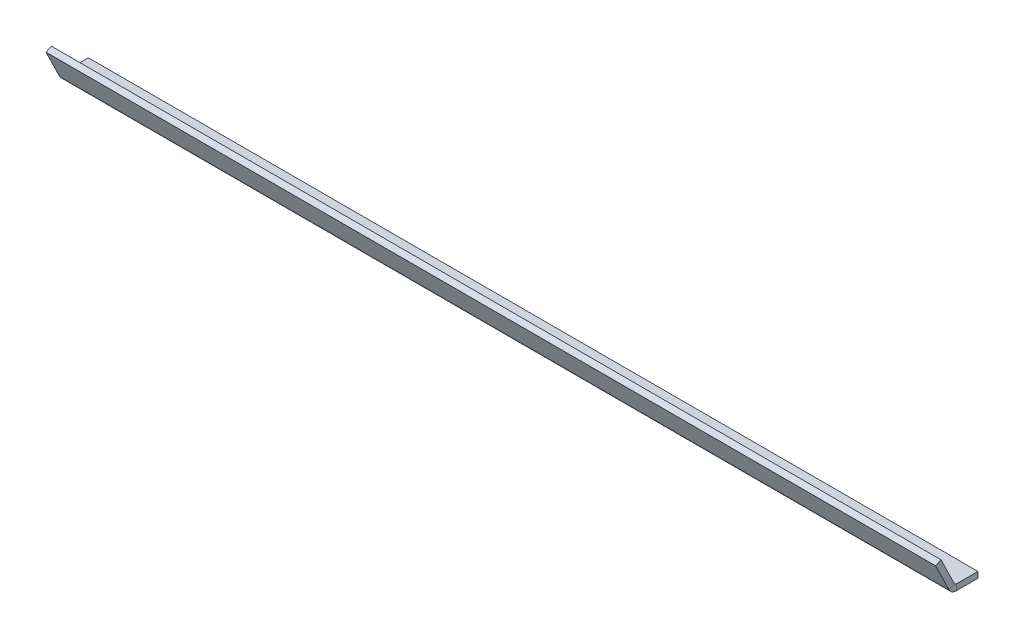
ISO-10303-21;
HEADER;
FILE_DESCRIPTION(('STEP AP214'),'2;1');
FILE_NAME('part.step','',(''),(''),'','','');
FILE_SCHEMA(('AUTOMOTIVE_DESIGN { 1 0 10303 214 1 1 1 1 }'));
ENDSEC;
DATA;
#1=APPLICATION_CONTEXT('core data for automotive mechanical design processes');
#2=APPLICATION_PROTOCOL_DEFINITION('international standard','automotive_design',2000,#1);
#3=PRODUCT_CONTEXT('',#1,'mechanical');
#4=PRODUCT('Part','Part','',(#3));
#5=PRODUCT_RELATED_PRODUCT_CATEGORY('part','',(#4));
#6=PRODUCT_DEFINITION_FORMATION('','',#4);
#7=PRODUCT_DEFINITION_CONTEXT('part definition',#1,'design');
#8=PRODUCT_DEFINITION('design','',#6,#7);
#9=PRODUCT_DEFINITION_SHAPE('','',#8);
#10=(LENGTH_UNIT() NAMED_UNIT(*) SI_UNIT(.MILLI.,.METRE.));
#11=(NAMED_UNIT(*) PLANE_ANGLE_UNIT() SI_UNIT($,.RADIAN.));
#12=(NAMED_UNIT(*) SI_UNIT($,.STERADIAN.) SOLID_ANGLE_UNIT());
#13=UNCERTAINTY_MEASURE_WITH_UNIT(LENGTH_MEASURE(1.E-05),#10,'distance_accuracy_value','');
#14=(GEOMETRIC_REPRESENTATION_CONTEXT(3) GLOBAL_UNCERTAINTY_ASSIGNED_CONTEXT((#13)) GLOBAL_UNIT_ASSIGNED_CONTEXT((#10,
#11,#12)) REPRESENTATION_CONTEXT('',''));
#15=CARTESIAN_POINT('',(0.,0.,0.));
#16=DIRECTION('',(0.,0.,1.));
#17=DIRECTION('',(1.,0.,0.));
#18=AXIS2_PLACEMENT_3D('',#15,#16,#17);
#19=CARTESIAN_POINT('',(600.,-8.,-1.14215139778495E-13));
#20=DIRECTION('',(1.,0.,0.));
#21=DIRECTION('',(0.,0.,-1.));
#22=AXIS2_PLACEMENT_3D('',#19,#20,#21);
#23=PLANE('',#22);
#24=DIRECTION('',(0.,0.,-1.));
#25=VECTOR('',#24,1.);
#26=CARTESIAN_POINT('',(600.,0.,-1.14215139778495E-13));
#27=LINE('',#26,#25);
#28=CARTESIAN_POINT('',(600.,0.,-10.7754235795295));
#29=VERTEX_POINT('',#28);
#30=CARTESIAN_POINT('',(600.,0.,-40.0000000000001));
#31=VERTEX_POINT('',#30);
#32=EDGE_CURVE('E104',#29,#31,#27,.T.);
#33=ORIENTED_EDGE('',*,*,#32,.F.);
#34=DIRECTION('',(0.,-1.,0.));
#35=VECTOR('',#34,1.);
#36=CARTESIAN_POINT('',(600.,1.55257751099924E-13,-10.7754235795295));
#37=LINE('',#36,#35);
#38=CARTESIAN_POINT('',(600.,-7.99999999999984,-10.7754235795297));
#39=VERTEX_POINT('',#38);
#40=EDGE_CURVE('E113',#29,#39,#37,.T.);
#41=ORIENTED_EDGE('',*,*,#40,.T.);
#42=DIRECTION('',(0.,0.,-1.));
#43=VECTOR('',#42,1.);
#44=CARTESIAN_POINT('',(600.,-8.,-1.14215139778495E-13));
#45=LINE('',#44,#43);
#46=CARTESIAN_POINT('',(600.,-8.,-40.0000000000001));
#47=VERTEX_POINT('',#46);
#48=EDGE_CURVE('E101',#39,#47,#45,.T.);
#49=ORIENTED_EDGE('',*,*,#48,.T.);
#50=DIRECTION('',(0.,1.,0.));
#51=VECTOR('',#50,1.);
#52=CARTESIAN_POINT('',(600.,-8.,-40.0000000000001));
#53=LINE('',#52,#51);
#54=EDGE_CURVE('E59',#47,#31,#53,.T.);
#55=ORIENTED_EDGE('',*,*,#54,.T.);
#56=EDGE_LOOP('',(#33,#41,#49,#55));
#57=FACE_BOUND('',#56,.T.);
#58=ADVANCED_FACE('F56',(#57),#23,.T.);
#59=CARTESIAN_POINT('',(0.,-8.,0.));
#60=DIRECTION('',(0.,1.,0.));
#61=DIRECTION('',(0.,0.,1.));
#62=AXIS2_PLACEMENT_3D('',#59,#60,#61);
#63=PLANE('',#62);
#64=DIRECTION('',(1.,0.,0.));
#65=VECTOR('',#64,1.);
#66=CARTESIAN_POINT('',(600.,-7.99999999999984,-10.7754235795297));
#67=LINE('',#66,#65);
#68=CARTESIAN_POINT('',(-600.,-8.,-10.7754235795295));
#69=VERTEX_POINT('',#68);
#70=EDGE_CURVE('E129',#39,#69,#67,.F.);
#71=ORIENTED_EDGE('',*,*,#70,.T.);
#72=DIRECTION('',(0.,0.,1.));
#73=VECTOR('',#72,1.);
#74=CARTESIAN_POINT('',(-600.,-8.,0.));
#75=LINE('',#74,#73);
#76=CARTESIAN_POINT('',(-600.,-8.,-40.));
#77=VERTEX_POINT('',#76);
#78=EDGE_CURVE('E109',#77,#69,#75,.T.);
#79=ORIENTED_EDGE('',*,*,#78,.F.);
#80=DIRECTION('',(-1.,0.,0.));
#81=VECTOR('',#80,1.);
#82=CARTESIAN_POINT('',(600.,-8.,-40.0000000000001));
#83=LINE('',#82,#81);
#84=EDGE_CURVE('E94',#47,#77,#83,.T.);
#85=ORIENTED_EDGE('',*,*,#84,.F.);
#86=ORIENTED_EDGE('',*,*,#48,.F.);
#87=EDGE_LOOP('',(#71,#79,#85,#86));
#88=FACE_BOUND('',#87,.T.);
#89=ADVANCED_FACE('F207',(#88),#63,.F.);
#90=CARTESIAN_POINT('',(0.,0.,0.));
#91=DIRECTION('',(0.,1.,0.));
#92=DIRECTION('',(0.,0.,1.));
#93=AXIS2_PLACEMENT_3D('',#90,#91,#92);
#94=PLANE('',#93);
#95=DIRECTION('',(0.,0.,1.));
#96=VECTOR('',#95,1.);
#97=CARTESIAN_POINT('',(-600.,0.,0.));
#98=LINE('',#97,#96);
#99=CARTESIAN_POINT('',(-600.,0.,-40.));
#100=VERTEX_POINT('',#99);
#101=CARTESIAN_POINT('',(-600.,0.,-10.7754235795295));
#102=VERTEX_POINT('',#101);
#103=EDGE_CURVE('E96',#100,#102,#98,.T.);
#104=ORIENTED_EDGE('',*,*,#103,.T.);
#105=DIRECTION('',(1.,0.,0.));
#106=VECTOR('',#105,1.);
#107=CARTESIAN_POINT('',(600.,1.55257751099924E-13,-10.7754235795295));
#108=LINE('',#107,#106);
#109=EDGE_CURVE('E70',#29,#102,#108,.F.);
#110=ORIENTED_EDGE('',*,*,#109,.F.);
#111=ORIENTED_EDGE('',*,*,#32,.T.);
#112=DIRECTION('',(-1.,0.,0.));
#113=VECTOR('',#112,1.);
#114=CARTESIAN_POINT('',(600.,0.,-40.0000000000001));
#115=LINE('',#114,#113);
#116=EDGE_CURVE('E92',#31,#100,#115,.T.);
#117=ORIENTED_EDGE('',*,*,#116,.T.);
#118=EDGE_LOOP('',(#104,#110,#111,#117));
#119=FACE_BOUND('',#118,.T.);
#120=ADVANCED_FACE('F103',(#119),#94,.T.);
#121=CARTESIAN_POINT('',(-600.,-8.,0.));
#122=DIRECTION('',(-1.,0.,0.));
#123=DIRECTION('',(0.,0.,1.));
#124=AXIS2_PLACEMENT_3D('',#121,#122,#123);
#125=PLANE('',#124);
#126=DIRECTION('',(0.,-1.,0.));
#127=VECTOR('',#126,1.);
#128=CARTESIAN_POINT('',(-600.,0.,-10.7754235795295));
#129=LINE('',#128,#127);
#130=EDGE_CURVE('E100',#102,#69,#129,.T.);
#131=ORIENTED_EDGE('',*,*,#130,.F.);
#132=ORIENTED_EDGE('',*,*,#103,.F.);
#133=DIRECTION('',(0.,1.,0.));
#134=VECTOR('',#133,1.);
#135=CARTESIAN_POINT('',(-600.,-8.,-40.));
#136=LINE('',#135,#134);
#137=EDGE_CURVE('E13',#77,#100,#136,.T.);
#138=ORIENTED_EDGE('',*,*,#137,.F.);
#139=ORIENTED_EDGE('',*,*,#78,.T.);
#140=EDGE_LOOP('',(#131,#132,#138,#139));
#141=FACE_BOUND('',#140,.T.);
#142=ADVANCED_FACE('F97',(#141),#125,.T.);
#143=CARTESIAN_POINT('',(600.,-8.,-40.0000000000001));
#144=DIRECTION('',(0.,0.,-1.));
#145=DIRECTION('',(-1.,0.,0.));
#146=AXIS2_PLACEMENT_3D('',#143,#144,#145);
#147=PLANE('',#146);
#148=ORIENTED_EDGE('',*,*,#116,.F.);
#149=ORIENTED_EDGE('',*,*,#54,.F.);
#150=ORIENTED_EDGE('',*,*,#84,.T.);
#151=ORIENTED_EDGE('',*,*,#137,.T.);
#152=EDGE_LOOP('',(#148,#149,#150,#151));
#153=FACE_BOUND('',#152,.T.);
#154=ADVANCED_FACE('F89',(#153),#147,.T.);
#155=CARTESIAN_POINT('',(-600.,3.00000000000001,-10.7754235795295));
#156=DIRECTION('',(-1.,0.,0.));
#157=DIRECTION('',(0.,-1.,0.));
#158=AXIS2_PLACEMENT_3D('',#155,#156,#157);
#159=PLANE('',#158);
#160=DIRECTION('',(0.,0.438371146789081,-0.898794046299165));
#161=VECTOR('',#160,1.);
#162=CARTESIAN_POINT('',(-600.,-1.82208261467989,-0.888689070238611));
#163=LINE('',#162,#161);
#164=CARTESIAN_POINT('',(-600.,1.68488655963275,-8.07904144063195));
#165=VERTEX_POINT('',#164);
#166=CARTESIAN_POINT('',(-600.,-1.8220826146799,-0.888689070238625));
#167=VERTEX_POINT('',#166);
#168=EDGE_CURVE('E134',#165,#167,#163,.F.);
#169=ORIENTED_EDGE('',*,*,#168,.F.);
#170=CARTESIAN_POINT('',(-600.,3.00000000000001,-10.7754235795295));
#171=DIRECTION('',(1.,0.,0.));
#172=DIRECTION('',(0.,1.,0.));
#173=AXIS2_PLACEMENT_3D('',#170,#171,#172);
#174=CIRCLE('',#173,3.00000000000003);
#175=EDGE_CURVE('E123',#102,#165,#174,.F.);
#176=ORIENTED_EDGE('',*,*,#175,.F.);
#177=ORIENTED_EDGE('',*,*,#130,.T.);
#178=CARTESIAN_POINT('',(-600.,3.00000000000001,-10.7754235795295));
#179=DIRECTION('',(1.,0.,0.));
#180=DIRECTION('',(0.,1.,0.));
#181=AXIS2_PLACEMENT_3D('',#178,#179,#180);
#182=CIRCLE('',#181,11.);
#183=EDGE_CURVE('E116',#69,#167,#182,.F.);
#184=ORIENTED_EDGE('',*,*,#183,.T.);
#185=EDGE_LOOP('',(#169,#176,#177,#184));
#186=FACE_BOUND('',#185,.T.);
#187=ADVANCED_FACE('F211',(#186),#159,.T.);
#188=CARTESIAN_POINT('',(600.,3.00000000000018,-10.7754235795295));
#189=DIRECTION('',(-1.,0.,0.));
#190=DIRECTION('',(0.,-1.,0.));
#191=AXIS2_PLACEMENT_3D('',#188,#189,#190);
#192=PLANE('',#191);
#193=CARTESIAN_POINT('',(600.,3.00000000000018,-10.7754235795295));
#194=DIRECTION('',(1.,0.,0.));
#195=DIRECTION('',(0.,1.,0.));
#196=AXIS2_PLACEMENT_3D('',#193,#194,#195);
#197=CIRCLE('',#196,3.00000000000003);
#198=CARTESIAN_POINT('',(600.,1.68488655963293,-8.07904144063195));
#199=VERTEX_POINT('',#198);
#200=EDGE_CURVE('E118',#199,#29,#197,.T.);
#201=ORIENTED_EDGE('',*,*,#200,.F.);
#202=DIRECTION('',(0.,0.438371146789081,-0.898794046299165));
#203=VECTOR('',#202,1.);
#204=CARTESIAN_POINT('',(600.,1.68488655963294,-8.07904144063201));
#205=LINE('',#204,#203);
#206=CARTESIAN_POINT('',(600.,-1.82208261467972,-0.888689070238673));
#207=VERTEX_POINT('',#206);
#208=EDGE_CURVE('E140',#199,#207,#205,.F.);
#209=ORIENTED_EDGE('',*,*,#208,.T.);
#210=CARTESIAN_POINT('',(600.,3.00000000000018,-10.7754235795295));
#211=DIRECTION('',(1.,0.,0.));
#212=DIRECTION('',(0.,1.,0.));
#213=AXIS2_PLACEMENT_3D('',#210,#211,#212);
#214=CIRCLE('',#213,11.);
#215=EDGE_CURVE('E126',#207,#39,#214,.T.);
#216=ORIENTED_EDGE('',*,*,#215,.T.);
#217=ORIENTED_EDGE('',*,*,#40,.F.);
#218=EDGE_LOOP('',(#201,#209,#216,#217));
#219=FACE_BOUND('',#218,.T.);
#220=ADVANCED_FACE('F221',(#219),#192,.F.);
#221=CARTESIAN_POINT('',(600.,3.00000000000018,-10.7754235795295));
#222=DIRECTION('',(1.,0.,0.));
#223=DIRECTION('',(0.,-0.438371146789082,0.898794046299165));
#224=AXIS2_PLACEMENT_3D('',#221,#222,#223);
#225=CYLINDRICAL_SURFACE('',#224,11.);
#226=ORIENTED_EDGE('',*,*,#70,.F.);
#227=ORIENTED_EDGE('',*,*,#215,.F.);
#228=DIRECTION('',(1.,0.,0.));
#229=VECTOR('',#228,1.);
#230=CARTESIAN_POINT('',(-600.,-1.82208261467989,-0.888689070238612));
#231=LINE('',#230,#229);
#232=EDGE_CURVE('E143',#207,#167,#231,.F.);
#233=ORIENTED_EDGE('',*,*,#232,.T.);
#234=ORIENTED_EDGE('',*,*,#183,.F.);
#235=EDGE_LOOP('',(#226,#227,#233,#234));
#236=FACE_BOUND('',#235,.T.);
#237=ADVANCED_FACE('F212',(#236),#225,.T.);
#238=CARTESIAN_POINT('',(600.,3.00000000000018,-10.7754235795295));
#239=DIRECTION('',(1.,0.,0.));
#240=DIRECTION('',(0.,-0.438371146789082,0.898794046299165));
#241=AXIS2_PLACEMENT_3D('',#238,#239,#240);
#242=CYLINDRICAL_SURFACE('',#241,3.00000000000003);
#243=ORIENTED_EDGE('',*,*,#109,.T.);
#244=ORIENTED_EDGE('',*,*,#175,.T.);
#245=DIRECTION('',(1.,0.,0.));
#246=VECTOR('',#245,1.);
#247=CARTESIAN_POINT('',(-600.,1.68488655963277,-8.07904144063195));
#248=LINE('',#247,#246);
#249=EDGE_CURVE('E137',#165,#199,#248,.T.);
#250=ORIENTED_EDGE('',*,*,#249,.T.);
#251=ORIENTED_EDGE('',*,*,#200,.T.);
#252=EDGE_LOOP('',(#243,#244,#250,#251));
#253=FACE_BOUND('',#252,.T.);
#254=ADVANCED_FACE('F224',(#253),#242,.F.);
#255=CARTESIAN_POINT('',(-600.,-3.50696917431267,-1.71046315340814));
#256=DIRECTION('',(1.,0.,0.));
#257=DIRECTION('',(0.,0.,-1.));
#258=AXIS2_PLACEMENT_3D('',#255,#256,#257);
#259=PLANE('',#258);
#260=ORIENTED_EDGE('',*,*,#168,.T.);
#261=DIRECTION('',(0.,-0.898794046299165,-0.438371146789082));
#262=VECTOR('',#261,1.);
#263=CARTESIAN_POINT('',(-600.,-3.50696917431268,-1.71046315340815));
#264=LINE('',#263,#262);
#265=CARTESIAN_POINT('',(-600.,35.1421142223599,17.139954337349));
#266=VERTEX_POINT('',#265);
#267=EDGE_CURVE('E155',#266,#167,#264,.T.);
#268=ORIENTED_EDGE('',*,*,#267,.F.);
#269=DIRECTION('',(0.,0.438371146789082,-0.898794046299165));
#270=VECTOR('',#269,1.);
#271=CARTESIAN_POINT('',(-600.,35.1421142223599,17.139954337349));
#272=LINE('',#271,#270);
#273=CARTESIAN_POINT('',(-600.,38.6490833966726,9.94960196695573));
#274=VERTEX_POINT('',#273);
#275=EDGE_CURVE('E164',#266,#274,#272,.T.);
#276=ORIENTED_EDGE('',*,*,#275,.T.);
#277=DIRECTION('',(0.,0.898794046299165,0.438371146789082));
#278=VECTOR('',#277,1.);
#279=CARTESIAN_POINT('',(-600.,0.,-8.90081552380147));
#280=LINE('',#279,#278);
#281=EDGE_CURVE('E146',#274,#165,#280,.F.);
#282=ORIENTED_EDGE('',*,*,#281,.T.);
#283=EDGE_LOOP('',(#260,#268,#276,#282));
#284=FACE_BOUND('',#283,.T.);
#285=ADVANCED_FACE('F190',(#284),#259,.F.);
#286=CARTESIAN_POINT('',(600.,35.1421142223599,17.1399543373489));
#287=DIRECTION('',(-1.,0.,0.));
#288=DIRECTION('',(0.,0.,1.));
#289=AXIS2_PLACEMENT_3D('',#286,#287,#288);
#290=PLANE('',#289);
#291=ORIENTED_EDGE('',*,*,#208,.F.);
#292=DIRECTION('',(0.,-0.898794046299165,-0.438371146789082));
#293=VECTOR('',#292,1.);
#294=CARTESIAN_POINT('',(600.,38.6490833966726,9.94960196695558));
#295=LINE('',#294,#293);
#296=CARTESIAN_POINT('',(600.,38.6490833966726,9.94960196695558));
#297=VERTEX_POINT('',#296);
#298=EDGE_CURVE('E149',#199,#297,#295,.F.);
#299=ORIENTED_EDGE('',*,*,#298,.T.);
#300=DIRECTION('',(0.,0.438371146789082,-0.898794046299165));
#301=VECTOR('',#300,1.);
#302=CARTESIAN_POINT('',(600.,35.1421142223599,17.1399543373489));
#303=LINE('',#302,#301);
#304=CARTESIAN_POINT('',(600.,35.1421142223599,17.1399543373489));
#305=VERTEX_POINT('',#304);
#306=EDGE_CURVE('E121',#305,#297,#303,.T.);
#307=ORIENTED_EDGE('',*,*,#306,.F.);
#308=DIRECTION('',(0.,0.898794046299165,0.438371146789082));
#309=VECTOR('',#308,1.);
#310=CARTESIAN_POINT('',(600.,-3.50696917431262,-1.71046315340827));
#311=LINE('',#310,#309);
#312=EDGE_CURVE('E158',#207,#305,#311,.T.);
#313=ORIENTED_EDGE('',*,*,#312,.F.);
#314=EDGE_LOOP('',(#291,#299,#307,#313));
#315=FACE_BOUND('',#314,.T.);
#316=ADVANCED_FACE('F218',(#315),#290,.F.);
#317=CARTESIAN_POINT('',(0.,-3.50696917431265,-1.71046315340821));
#318=DIRECTION('',(0.,0.438371146789082,-0.898794046299165));
#319=DIRECTION('',(0.,0.898794046299165,0.438371146789082));
#320=AXIS2_PLACEMENT_3D('',#317,#318,#319);
#321=PLANE('',#320);
#322=ORIENTED_EDGE('',*,*,#232,.F.);
#323=ORIENTED_EDGE('',*,*,#312,.T.);
#324=DIRECTION('',(-1.,0.,0.));
#325=VECTOR('',#324,1.);
#326=CARTESIAN_POINT('',(0.,35.1421142223599,17.139954337349));
#327=LINE('',#326,#325);
#328=EDGE_CURVE('E161',#305,#266,#327,.T.);
#329=ORIENTED_EDGE('',*,*,#328,.T.);
#330=ORIENTED_EDGE('',*,*,#267,.T.);
#331=EDGE_LOOP('',(#322,#323,#329,#330));
#332=FACE_BOUND('',#331,.T.);
#333=ADVANCED_FACE('F215',(#332),#321,.F.);
#334=CARTESIAN_POINT('',(0.,0.,-8.90081552380153));
#335=DIRECTION('',(0.,0.438371146789082,-0.898794046299165));
#336=DIRECTION('',(0.,0.898794046299165,0.438371146789082));
#337=AXIS2_PLACEMENT_3D('',#334,#335,#336);
#338=PLANE('',#337);
#339=ORIENTED_EDGE('',*,*,#298,.F.);
#340=ORIENTED_EDGE('',*,*,#249,.F.);
#341=ORIENTED_EDGE('',*,*,#281,.F.);
#342=DIRECTION('',(1.,0.,0.));
#343=VECTOR('',#342,1.);
#344=CARTESIAN_POINT('',(-600.,38.6490833966726,9.94960196695573));
#345=LINE('',#344,#343);
#346=EDGE_CURVE('E152',#297,#274,#345,.F.);
#347=ORIENTED_EDGE('',*,*,#346,.F.);
#348=EDGE_LOOP('',(#339,#340,#341,#347));
#349=FACE_BOUND('',#348,.T.);
#350=ADVANCED_FACE('F184',(#349),#338,.T.);
#351=CARTESIAN_POINT('',(-600.,35.1421142223599,17.139954337349));
#352=DIRECTION('',(0.,-0.898794046299165,-0.438371146789082));
#353=DIRECTION('',(0.,0.438371146789082,-0.898794046299165));
#354=AXIS2_PLACEMENT_3D('',#351,#352,#353);
#355=PLANE('',#354);
#356=ORIENTED_EDGE('',*,*,#346,.T.);
#357=ORIENTED_EDGE('',*,*,#275,.F.);
#358=ORIENTED_EDGE('',*,*,#328,.F.);
#359=ORIENTED_EDGE('',*,*,#306,.T.);
#360=EDGE_LOOP('',(#356,#357,#358,#359));
#361=FACE_BOUND('',#360,.T.);
#362=ADVANCED_FACE('F173',(#361),#355,.F.);
#363=CLOSED_SHELL('',(#58,#89,#120,#142,#154,#187,#220,#237,#254,#285,#316,#333,#350,#362));
#364=MANIFOLD_SOLID_BREP('B2',#363);
#365=ADVANCED_BREP_SHAPE_REPRESENTATION('',(#18,#364),#14);
#366=SHAPE_DEFINITION_REPRESENTATION(#9,#365);
ENDSEC;
END-ISO-10303-21;
